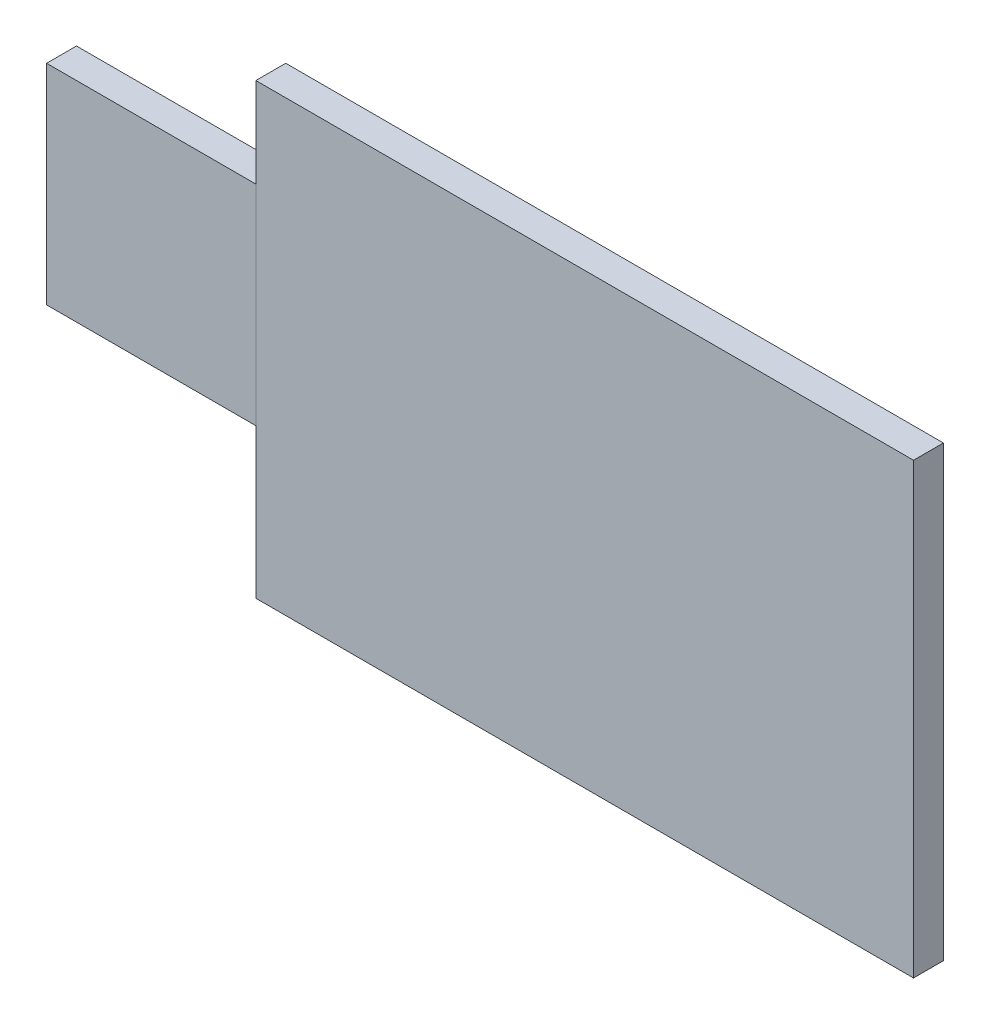
ISO-10303-21;
HEADER;
FILE_DESCRIPTION(('STEP AP214'),'2;1');
FILE_NAME('part.step','',(''),(''),'','','');
FILE_SCHEMA(('AUTOMOTIVE_DESIGN { 1 0 10303 214 1 1 1 1 }'));
ENDSEC;
DATA;
#1=APPLICATION_CONTEXT('core data for automotive mechanical design processes');
#2=APPLICATION_PROTOCOL_DEFINITION('international standard','automotive_design',2000,#1);
#3=PRODUCT_CONTEXT('',#1,'mechanical');
#4=PRODUCT('Part','Part','',(#3));
#5=PRODUCT_RELATED_PRODUCT_CATEGORY('part','',(#4));
#6=PRODUCT_DEFINITION_FORMATION('','',#4);
#7=PRODUCT_DEFINITION_CONTEXT('part definition',#1,'design');
#8=PRODUCT_DEFINITION('design','',#6,#7);
#9=PRODUCT_DEFINITION_SHAPE('','',#8);
#10=(LENGTH_UNIT() NAMED_UNIT(*) SI_UNIT(.MILLI.,.METRE.));
#11=(NAMED_UNIT(*) PLANE_ANGLE_UNIT() SI_UNIT($,.RADIAN.));
#12=(NAMED_UNIT(*) SI_UNIT($,.STERADIAN.) SOLID_ANGLE_UNIT());
#13=UNCERTAINTY_MEASURE_WITH_UNIT(LENGTH_MEASURE(1.E-05),#10,'distance_accuracy_value','');
#14=(GEOMETRIC_REPRESENTATION_CONTEXT(3) GLOBAL_UNCERTAINTY_ASSIGNED_CONTEXT((#13)) GLOBAL_UNIT_ASSIGNED_CONTEXT((#10,
#11,#12)) REPRESENTATION_CONTEXT('',''));
#15=CARTESIAN_POINT('',(0.,0.,0.));
#16=DIRECTION('',(0.,0.,1.));
#17=DIRECTION('',(1.,0.,0.));
#18=AXIS2_PLACEMENT_3D('',#15,#16,#17);
#19=CARTESIAN_POINT('',(-4972.41379310345,-6161.62727401699,-1000.));
#20=DIRECTION('',(0.,-1.,0.));
#21=DIRECTION('',(0.,0.,-1.));
#22=AXIS2_PLACEMENT_3D('',#19,#20,#21);
#23=PLANE('',#22);
#24=DIRECTION('',(1.,0.,0.));
#25=VECTOR('',#24,1.);
#26=CARTESIAN_POINT('',(-4972.41379310345,-6161.62727401699,0.));
#27=LINE('',#26,#25);
#28=CARTESIAN_POINT('',(-4972.41379310345,-6161.62727401699,0.));
#29=VERTEX_POINT('',#28);
#30=CARTESIAN_POINT('',(2027.58620689655,-6161.62727401699,0.));
#31=VERTEX_POINT('',#30);
#32=EDGE_CURVE('E111',#29,#31,#27,.T.);
#33=ORIENTED_EDGE('',*,*,#32,.F.);
#34=DIRECTION('',(0.,0.,1.));
#35=VECTOR('',#34,1.);
#36=CARTESIAN_POINT('',(-4972.41379310345,-6161.62727401699,-1000.));
#37=LINE('',#36,#35);
#38=CARTESIAN_POINT('',(-4972.41379310345,-6161.62727401699,-1000.));
#39=VERTEX_POINT('',#38);
#40=EDGE_CURVE('E12',#39,#29,#37,.T.);
#41=ORIENTED_EDGE('',*,*,#40,.F.);
#42=DIRECTION('',(1.,0.,0.));
#43=VECTOR('',#42,1.);
#44=CARTESIAN_POINT('',(-4972.41379310345,-6161.62727401699,-1000.));
#45=LINE('',#44,#43);
#46=CARTESIAN_POINT('',(2027.58620689655,-6161.62727401699,-1000.));
#47=VERTEX_POINT('',#46);
#48=EDGE_CURVE('E105',#39,#47,#45,.T.);
#49=ORIENTED_EDGE('',*,*,#48,.T.);
#50=DIRECTION('',(0.,0.,1.));
#51=VECTOR('',#50,1.);
#52=CARTESIAN_POINT('',(2027.58620689655,-6161.62727401699,-1000.));
#53=LINE('',#52,#51);
#54=EDGE_CURVE('E50',#47,#31,#53,.T.);
#55=ORIENTED_EDGE('',*,*,#54,.T.);
#56=EDGE_LOOP('',(#33,#41,#49,#55));
#57=FACE_BOUND('',#56,.T.);
#58=ADVANCED_FACE('F47',(#57),#23,.T.);
#59=CARTESIAN_POINT('',(-4972.41379310345,838.372725983009,-1000.));
#60=DIRECTION('',(-1.,0.,0.));
#61=DIRECTION('',(0.,0.,1.));
#62=AXIS2_PLACEMENT_3D('',#59,#60,#61);
#63=PLANE('',#62);
#64=DIRECTION('',(0.,-1.,0.));
#65=VECTOR('',#64,1.);
#66=CARTESIAN_POINT('',(-4972.41379310345,838.372725983009,0.));
#67=LINE('',#66,#65);
#68=CARTESIAN_POINT('',(-4972.41379310345,838.372725983009,0.));
#69=VERTEX_POINT('',#68);
#70=EDGE_CURVE('E107',#69,#29,#67,.T.);
#71=ORIENTED_EDGE('',*,*,#70,.F.);
#72=DIRECTION('',(0.,0.,1.));
#73=VECTOR('',#72,1.);
#74=CARTESIAN_POINT('',(-4972.41379310345,838.372725983009,-1000.));
#75=LINE('',#74,#73);
#76=CARTESIAN_POINT('',(-4972.41379310345,838.372725983009,-1000.));
#77=VERTEX_POINT('',#76);
#78=EDGE_CURVE('E56',#77,#69,#75,.T.);
#79=ORIENTED_EDGE('',*,*,#78,.F.);
#80=DIRECTION('',(0.,-1.,0.));
#81=VECTOR('',#80,1.);
#82=CARTESIAN_POINT('',(-4972.41379310345,838.372725983009,-1000.));
#83=LINE('',#82,#81);
#84=EDGE_CURVE('E95',#77,#39,#83,.T.);
#85=ORIENTED_EDGE('',*,*,#84,.T.);
#86=ORIENTED_EDGE('',*,*,#40,.T.);
#87=EDGE_LOOP('',(#71,#79,#85,#86));
#88=FACE_BOUND('',#87,.T.);
#89=ADVANCED_FACE('F121',(#88),#63,.T.);
#90=CARTESIAN_POINT('',(-4972.41379310345,838.372725983009,-1000.));
#91=DIRECTION('',(0.,-1.,0.));
#92=DIRECTION('',(0.,0.,-1.));
#93=AXIS2_PLACEMENT_3D('',#90,#91,#92);
#94=PLANE('',#93);
#95=DIRECTION('',(1.,0.,0.));
#96=VECTOR('',#95,1.);
#97=CARTESIAN_POINT('',(-4972.41379310345,838.372725983009,0.));
#98=LINE('',#97,#96);
#99=CARTESIAN_POINT('',(2027.58620689655,838.372725983009,0.));
#100=VERTEX_POINT('',#99);
#101=EDGE_CURVE('E100',#69,#100,#98,.T.);
#102=ORIENTED_EDGE('',*,*,#101,.T.);
#103=DIRECTION('',(0.,0.,1.));
#104=VECTOR('',#103,1.);
#105=CARTESIAN_POINT('',(2027.58620689655,838.372725983009,-1000.));
#106=LINE('',#105,#104);
#107=CARTESIAN_POINT('',(2027.58620689655,838.372725983009,-1000.));
#108=VERTEX_POINT('',#107);
#109=EDGE_CURVE('E98',#108,#100,#106,.T.);
#110=ORIENTED_EDGE('',*,*,#109,.F.);
#111=DIRECTION('',(1.,0.,0.));
#112=VECTOR('',#111,1.);
#113=CARTESIAN_POINT('',(-4972.41379310345,838.372725983009,-1000.));
#114=LINE('',#113,#112);
#115=EDGE_CURVE('E92',#77,#108,#114,.T.);
#116=ORIENTED_EDGE('',*,*,#115,.F.);
#117=ORIENTED_EDGE('',*,*,#78,.T.);
#118=EDGE_LOOP('',(#102,#110,#116,#117));
#119=FACE_BOUND('',#118,.T.);
#120=ADVANCED_FACE('F99',(#119),#94,.F.);
#121=CARTESIAN_POINT('',(2027.58620689655,838.372725983009,-1000.));
#122=DIRECTION('',(-1.,0.,0.));
#123=DIRECTION('',(0.,0.,1.));
#124=AXIS2_PLACEMENT_3D('',#121,#122,#123);
#125=PLANE('',#124);
#126=DIRECTION('',(0.,-1.,0.));
#127=VECTOR('',#126,1.);
#128=CARTESIAN_POINT('',(2027.58620689655,838.372725983009,0.));
#129=LINE('',#128,#127);
#130=EDGE_CURVE('E114',#100,#31,#129,.T.);
#131=ORIENTED_EDGE('',*,*,#130,.T.);
#132=ORIENTED_EDGE('',*,*,#54,.F.);
#133=DIRECTION('',(0.,-1.,0.));
#134=VECTOR('',#133,1.);
#135=CARTESIAN_POINT('',(2027.58620689655,838.372725983009,-1000.));
#136=LINE('',#135,#134);
#137=EDGE_CURVE('E89',#108,#47,#136,.T.);
#138=ORIENTED_EDGE('',*,*,#137,.F.);
#139=ORIENTED_EDGE('',*,*,#109,.T.);
#140=EDGE_LOOP('',(#131,#132,#138,#139));
#141=FACE_BOUND('',#140,.T.);
#142=ADVANCED_FACE('F104',(#141),#125,.F.);
#143=CARTESIAN_POINT('',(0.,-3000.,-1000.));
#144=DIRECTION('',(0.,0.,-1.));
#145=DIRECTION('',(-1.,0.,0.));
#146=AXIS2_PLACEMENT_3D('',#143,#144,#145);
#147=PLANE('',#146);
#148=ORIENTED_EDGE('',*,*,#48,.F.);
#149=ORIENTED_EDGE('',*,*,#84,.F.);
#150=ORIENTED_EDGE('',*,*,#115,.T.);
#151=ORIENTED_EDGE('',*,*,#137,.T.);
#152=EDGE_LOOP('',(#148,#149,#150,#151));
#153=FACE_BOUND('',#152,.T.);
#154=ADVANCED_FACE('F94',(#153),#147,.T.);
#155=CARTESIAN_POINT('',(0.,-3000.,0.));
#156=DIRECTION('',(0.,0.,-1.));
#157=DIRECTION('',(-1.,0.,0.));
#158=AXIS2_PLACEMENT_3D('',#155,#156,#157);
#159=PLANE('',#158);
#160=ORIENTED_EDGE('',*,*,#32,.T.);
#161=ORIENTED_EDGE('',*,*,#130,.F.);
#162=ORIENTED_EDGE('',*,*,#101,.F.);
#163=ORIENTED_EDGE('',*,*,#70,.T.);
#164=EDGE_LOOP('',(#160,#161,#162,#163));
#165=FACE_BOUND('',#164,.T.);
#166=ADVANCED_FACE('F120',(#165),#159,.F.);
#167=CLOSED_SHELL('',(#58,#89,#120,#142,#154,#166));
#168=MANIFOLD_SOLID_BREP('B2',#167);
#169=CARTESIAN_POINT('',(2027.58620689655,3838.37272598301,0.));
#170=DIRECTION('',(1.,0.,0.));
#171=DIRECTION('',(0.,0.,-1.));
#172=AXIS2_PLACEMENT_3D('',#169,#170,#171);
#173=PLANE('',#172);
#174=DIRECTION('',(0.,-1.,0.));
#175=VECTOR('',#174,1.);
#176=CARTESIAN_POINT('',(2027.58620689655,3838.37272598301,-1000.));
#177=LINE('',#176,#175);
#178=CARTESIAN_POINT('',(2027.58620689655,3838.37272598301,-1000.));
#179=VERTEX_POINT('',#178);
#180=CARTESIAN_POINT('',(2027.58620689655,-11161.627274017,-1000.));
#181=VERTEX_POINT('',#180);
#182=EDGE_CURVE('E233',#179,#181,#177,.T.);
#183=ORIENTED_EDGE('',*,*,#182,.T.);
#184=DIRECTION('',(0.,0.,-1.));
#185=VECTOR('',#184,1.);
#186=CARTESIAN_POINT('',(2027.58620689655,-11161.627274017,0.));
#187=LINE('',#186,#185);
#188=CARTESIAN_POINT('',(2027.58620689655,-11161.627274017,0.));
#189=VERTEX_POINT('',#188);
#190=EDGE_CURVE('E45',#189,#181,#187,.T.);
#191=ORIENTED_EDGE('',*,*,#190,.F.);
#192=DIRECTION('',(0.,-1.,0.));
#193=VECTOR('',#192,1.);
#194=CARTESIAN_POINT('',(2027.58620689655,3838.37272598301,0.));
#195=LINE('',#194,#193);
#196=CARTESIAN_POINT('',(2027.58620689655,3838.37272598301,0.));
#197=VERTEX_POINT('',#196);
#198=EDGE_CURVE('E219',#197,#189,#195,.T.);
#199=ORIENTED_EDGE('',*,*,#198,.F.);
#200=DIRECTION('',(0.,0.,-1.));
#201=VECTOR('',#200,1.);
#202=CARTESIAN_POINT('',(2027.58620689655,3838.37272598301,0.));
#203=LINE('',#202,#201);
#204=EDGE_CURVE('E186',#197,#179,#203,.T.);
#205=ORIENTED_EDGE('',*,*,#204,.T.);
#206=EDGE_LOOP('',(#183,#191,#199,#205));
#207=FACE_BOUND('',#206,.T.);
#208=ADVANCED_FACE('F170',(#207),#173,.F.);
#209=CARTESIAN_POINT('',(2027.58620689655,-11161.627274017,0.));
#210=DIRECTION('',(0.,1.,0.));
#211=DIRECTION('',(0.,0.,1.));
#212=AXIS2_PLACEMENT_3D('',#209,#210,#211);
#213=PLANE('',#212);
#214=DIRECTION('',(1.,0.,0.));
#215=VECTOR('',#214,1.);
#216=CARTESIAN_POINT('',(2027.58620689655,-11161.627274017,-1000.));
#217=LINE('',#216,#215);
#218=CARTESIAN_POINT('',(24027.5862068966,-11161.627274017,-1000.));
#219=VERTEX_POINT('',#218);
#220=EDGE_CURVE('E224',#181,#219,#217,.T.);
#221=ORIENTED_EDGE('',*,*,#220,.T.);
#222=DIRECTION('',(0.,0.,-1.));
#223=VECTOR('',#222,1.);
#224=CARTESIAN_POINT('',(24027.5862068966,-11161.627274017,0.));
#225=LINE('',#224,#223);
#226=CARTESIAN_POINT('',(24027.5862068966,-11161.627274017,0.));
#227=VERTEX_POINT('',#226);
#228=EDGE_CURVE('E178',#227,#219,#225,.T.);
#229=ORIENTED_EDGE('',*,*,#228,.F.);
#230=DIRECTION('',(1.,0.,0.));
#231=VECTOR('',#230,1.);
#232=CARTESIAN_POINT('',(2027.58620689655,-11161.627274017,0.));
#233=LINE('',#232,#231);
#234=EDGE_CURVE('E211',#189,#227,#233,.T.);
#235=ORIENTED_EDGE('',*,*,#234,.F.);
#236=ORIENTED_EDGE('',*,*,#190,.T.);
#237=EDGE_LOOP('',(#221,#229,#235,#236));
#238=FACE_BOUND('',#237,.T.);
#239=ADVANCED_FACE('F223',(#238),#213,.F.);
#240=CARTESIAN_POINT('',(24027.5862068966,3838.37272598301,0.));
#241=DIRECTION('',(1.,0.,0.));
#242=DIRECTION('',(0.,0.,-1.));
#243=AXIS2_PLACEMENT_3D('',#240,#241,#242);
#244=PLANE('',#243);
#245=DIRECTION('',(0.,-1.,0.));
#246=VECTOR('',#245,1.);
#247=CARTESIAN_POINT('',(24027.5862068966,3838.37272598301,-1000.));
#248=LINE('',#247,#246);
#249=CARTESIAN_POINT('',(24027.5862068966,3838.37272598301,-1000.));
#250=VERTEX_POINT('',#249);
#251=EDGE_CURVE('E236',#250,#219,#248,.T.);
#252=ORIENTED_EDGE('',*,*,#251,.F.);
#253=DIRECTION('',(0.,0.,-1.));
#254=VECTOR('',#253,1.);
#255=CARTESIAN_POINT('',(24027.5862068966,3838.37272598301,0.));
#256=LINE('',#255,#254);
#257=CARTESIAN_POINT('',(24027.5862068966,3838.37272598301,0.));
#258=VERTEX_POINT('',#257);
#259=EDGE_CURVE('E200',#258,#250,#256,.T.);
#260=ORIENTED_EDGE('',*,*,#259,.F.);
#261=DIRECTION('',(0.,-1.,0.));
#262=VECTOR('',#261,1.);
#263=CARTESIAN_POINT('',(24027.5862068966,3838.37272598301,0.));
#264=LINE('',#263,#262);
#265=EDGE_CURVE('E218',#258,#227,#264,.T.);
#266=ORIENTED_EDGE('',*,*,#265,.T.);
#267=ORIENTED_EDGE('',*,*,#228,.T.);
#268=EDGE_LOOP('',(#252,#260,#266,#267));
#269=FACE_BOUND('',#268,.T.);
#270=ADVANCED_FACE('F227',(#269),#244,.T.);
#271=CARTESIAN_POINT('',(2027.58620689655,3838.37272598301,0.));
#272=DIRECTION('',(0.,1.,0.));
#273=DIRECTION('',(0.,0.,1.));
#274=AXIS2_PLACEMENT_3D('',#271,#272,#273);
#275=PLANE('',#274);
#276=DIRECTION('',(1.,0.,0.));
#277=VECTOR('',#276,1.);
#278=CARTESIAN_POINT('',(2027.58620689655,3838.37272598301,-1000.));
#279=LINE('',#278,#277);
#280=EDGE_CURVE('E238',#179,#250,#279,.T.);
#281=ORIENTED_EDGE('',*,*,#280,.F.);
#282=ORIENTED_EDGE('',*,*,#204,.F.);
#283=DIRECTION('',(1.,0.,0.));
#284=VECTOR('',#283,1.);
#285=CARTESIAN_POINT('',(2027.58620689655,3838.37272598301,0.));
#286=LINE('',#285,#284);
#287=EDGE_CURVE('E228',#197,#258,#286,.T.);
#288=ORIENTED_EDGE('',*,*,#287,.T.);
#289=ORIENTED_EDGE('',*,*,#259,.T.);
#290=EDGE_LOOP('',(#281,#282,#288,#289));
#291=FACE_BOUND('',#290,.T.);
#292=ADVANCED_FACE('F244',(#291),#275,.T.);
#293=CARTESIAN_POINT('',(-13419.4074127963,-12030.7641593786,0.));
#294=DIRECTION('',(0.,0.,1.));
#295=DIRECTION('',(1.,0.,0.));
#296=AXIS2_PLACEMENT_3D('',#293,#294,#295);
#297=PLANE('',#296);
#298=ORIENTED_EDGE('',*,*,#198,.T.);
#299=ORIENTED_EDGE('',*,*,#234,.T.);
#300=ORIENTED_EDGE('',*,*,#265,.F.);
#301=ORIENTED_EDGE('',*,*,#287,.F.);
#302=EDGE_LOOP('',(#298,#299,#300,#301));
#303=FACE_BOUND('',#302,.T.);
#304=ADVANCED_FACE('F215',(#303),#297,.T.);
#305=CARTESIAN_POINT('',(-13419.4074127963,-12030.7641593786,-1000.));
#306=DIRECTION('',(0.,0.,1.));
#307=DIRECTION('',(1.,0.,0.));
#308=AXIS2_PLACEMENT_3D('',#305,#306,#307);
#309=PLANE('',#308);
#310=ORIENTED_EDGE('',*,*,#182,.F.);
#311=ORIENTED_EDGE('',*,*,#280,.T.);
#312=ORIENTED_EDGE('',*,*,#251,.T.);
#313=ORIENTED_EDGE('',*,*,#220,.F.);
#314=EDGE_LOOP('',(#310,#311,#312,#313));
#315=FACE_BOUND('',#314,.T.);
#316=ADVANCED_FACE('F243',(#315),#309,.F.);
#317=CLOSED_SHELL('',(#208,#239,#270,#292,#304,#316));
#318=MANIFOLD_SOLID_BREP('B6',#317);
#319=ADVANCED_BREP_SHAPE_REPRESENTATION('',(#18,#168,#318),#14);
#320=SHAPE_DEFINITION_REPRESENTATION(#9,#319);
ENDSEC;
END-ISO-10303-21;
